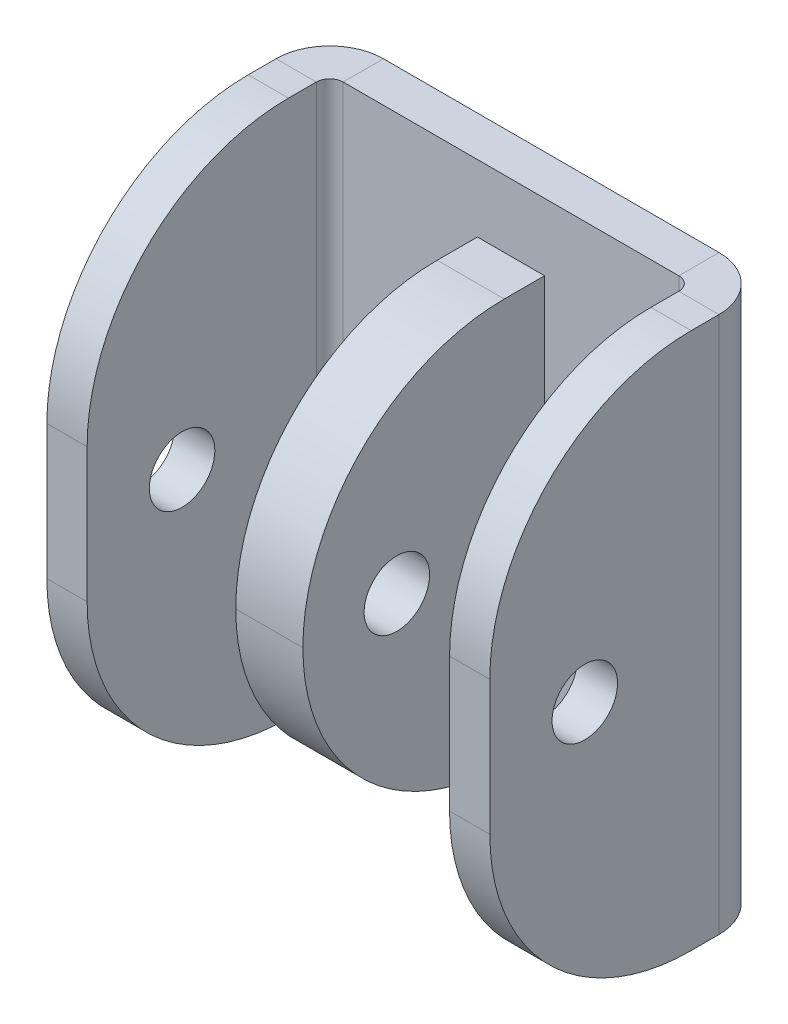
ISO-10303-21;
HEADER;
FILE_DESCRIPTION(('STEP AP214'),'2;1');
FILE_NAME('part.step','',(''),(''),'','','');
FILE_SCHEMA(('AUTOMOTIVE_DESIGN { 1 0 10303 214 1 1 1 1 }'));
ENDSEC;
DATA;
#1=APPLICATION_CONTEXT('core data for automotive mechanical design processes');
#2=APPLICATION_PROTOCOL_DEFINITION('international standard','automotive_design',2000,#1);
#3=PRODUCT_CONTEXT('',#1,'mechanical');
#4=PRODUCT('Part','Part','',(#3));
#5=PRODUCT_RELATED_PRODUCT_CATEGORY('part','',(#4));
#6=PRODUCT_DEFINITION_FORMATION('','',#4);
#7=PRODUCT_DEFINITION_CONTEXT('part definition',#1,'design');
#8=PRODUCT_DEFINITION('design','',#6,#7);
#9=PRODUCT_DEFINITION_SHAPE('','',#8);
#10=(LENGTH_UNIT() NAMED_UNIT(*) SI_UNIT(.MILLI.,.METRE.));
#11=(NAMED_UNIT(*) PLANE_ANGLE_UNIT() SI_UNIT($,.RADIAN.));
#12=(NAMED_UNIT(*) SI_UNIT($,.STERADIAN.) SOLID_ANGLE_UNIT());
#13=UNCERTAINTY_MEASURE_WITH_UNIT(LENGTH_MEASURE(1.E-05),#10,'distance_accuracy_value','');
#14=(GEOMETRIC_REPRESENTATION_CONTEXT(3) GLOBAL_UNCERTAINTY_ASSIGNED_CONTEXT((#13)) GLOBAL_UNIT_ASSIGNED_CONTEXT((#10,
#11,#12)) REPRESENTATION_CONTEXT('',''));
#15=CARTESIAN_POINT('',(0.,0.,0.));
#16=DIRECTION('',(0.,0.,1.));
#17=DIRECTION('',(1.,0.,0.));
#18=AXIS2_PLACEMENT_3D('',#15,#16,#17);
#19=CARTESIAN_POINT('',(0.,0.,3.));
#20=DIRECTION('',(0.,0.,1.));
#21=DIRECTION('',(1.,0.,0.));
#22=AXIS2_PLACEMENT_3D('',#19,#20,#21);
#23=PLANE('',#22);
#24=DIRECTION('',(1.,0.,0.));
#25=VECTOR('',#24,1.);
#26=CARTESIAN_POINT('',(-34.2624665260045,-15.6459633778807,3.));
#27=LINE('',#26,#25);
#28=CARTESIAN_POINT('',(-13.2624665260045,-15.6459633778807,3.));
#29=VERTEX_POINT('',#28);
#30=CARTESIAN_POINT('',(11.7375334739955,-15.6459633778807,3.));
#31=VERTEX_POINT('',#30);
#32=EDGE_CURVE('E333',#29,#31,#27,.T.);
#33=ORIENTED_EDGE('',*,*,#32,.T.);
#34=DIRECTION('',(0.,1.,0.));
#35=VECTOR('',#34,1.);
#36=CARTESIAN_POINT('',(11.7375334739955,0.,3.));
#37=LINE('',#36,#35);
#38=CARTESIAN_POINT('',(11.7375334739955,24.3540366221193,3.));
#39=VERTEX_POINT('',#38);
#40=EDGE_CURVE('E319',#31,#39,#37,.T.);
#41=ORIENTED_EDGE('',*,*,#40,.T.);
#42=DIRECTION('',(-1.,0.,0.));
#43=VECTOR('',#42,1.);
#44=CARTESIAN_POINT('',(-34.2624665260045,24.3540366221193,3.));
#45=LINE('',#44,#43);
#46=CARTESIAN_POINT('',(-13.2624665260045,24.3540366221193,3.));
#47=VERTEX_POINT('',#46);
#48=EDGE_CURVE('E310',#39,#47,#45,.T.);
#49=ORIENTED_EDGE('',*,*,#48,.T.);
#50=DIRECTION('',(0.,1.,0.));
#51=VECTOR('',#50,1.);
#52=CARTESIAN_POINT('',(-13.2624665260045,0.,3.));
#53=LINE('',#52,#51);
#54=EDGE_CURVE('E306',#29,#47,#53,.T.);
#55=ORIENTED_EDGE('',*,*,#54,.F.);
#56=EDGE_LOOP('',(#33,#41,#49,#55));
#57=FACE_BOUND('',#56,.T.);
#58=DIRECTION('',(1.,0.,0.));
#59=VECTOR('',#58,1.);
#60=CARTESIAN_POINT('',(-3.26246652600454,-10.6459633778807,3.));
#61=LINE('',#60,#59);
#62=CARTESIAN_POINT('',(-3.26246652600454,-10.6459633778807,3.));
#63=VERTEX_POINT('',#62);
#64=CARTESIAN_POINT('',(1.73753347399547,-10.6459633778807,3.));
#65=VERTEX_POINT('',#64);
#66=EDGE_CURVE('E197',#63,#65,#61,.T.);
#67=ORIENTED_EDGE('',*,*,#66,.F.);
#68=DIRECTION('',(0.,-1.,0.));
#69=VECTOR('',#68,1.);
#70=CARTESIAN_POINT('',(-3.26246652600454,19.3540366221193,3.));
#71=LINE('',#70,#69);
#72=CARTESIAN_POINT('',(-3.26246652600454,19.3540366221193,3.));
#73=VERTEX_POINT('',#72);
#74=EDGE_CURVE('E207',#73,#63,#71,.T.);
#75=ORIENTED_EDGE('',*,*,#74,.F.);
#76=DIRECTION('',(-1.,0.,0.));
#77=VECTOR('',#76,1.);
#78=CARTESIAN_POINT('',(-3.26246652600454,19.3540366221193,3.));
#79=LINE('',#78,#77);
#80=CARTESIAN_POINT('',(1.73753347399546,19.3540366221193,3.));
#81=VERTEX_POINT('',#80);
#82=EDGE_CURVE('E219',#81,#73,#79,.T.);
#83=ORIENTED_EDGE('',*,*,#82,.F.);
#84=DIRECTION('',(0.,1.,0.));
#85=VECTOR('',#84,1.);
#86=CARTESIAN_POINT('',(1.73753347399546,19.3540366221193,3.));
#87=LINE('',#86,#85);
#88=EDGE_CURVE('E217',#65,#81,#87,.T.);
#89=ORIENTED_EDGE('',*,*,#88,.F.);
#90=EDGE_LOOP('',(#67,#75,#83,#89));
#91=FACE_BOUND('',#90,.T.);
#92=ADVANCED_FACE('F49',(#57,#91),#23,.T.);
#93=CARTESIAN_POINT('',(-34.2624665260045,-15.6459633778807,3.));
#94=DIRECTION('',(0.,-1.,0.));
#95=DIRECTION('',(1.,0.,0.));
#96=AXIS2_PLACEMENT_3D('',#93,#94,#95);
#97=PLANE('',#96);
#98=DIRECTION('',(1.,0.,0.));
#99=VECTOR('',#98,1.);
#100=CARTESIAN_POINT('',(0.,-15.6459633778807,0.));
#101=LINE('',#100,#99);
#102=CARTESIAN_POINT('',(-13.2624665260045,-15.6459633778807,0.));
#103=VERTEX_POINT('',#102);
#104=CARTESIAN_POINT('',(11.7375334739955,-15.6459633778807,0.));
#105=VERTEX_POINT('',#104);
#106=EDGE_CURVE('E301',#103,#105,#101,.T.);
#107=ORIENTED_EDGE('',*,*,#106,.T.);
#108=DIRECTION('',(0.,0.,1.));
#109=VECTOR('',#108,1.);
#110=CARTESIAN_POINT('',(11.7375334739955,-15.6459633778807,3.));
#111=LINE('',#110,#109);
#112=EDGE_CURVE('E322',#105,#31,#111,.T.);
#113=ORIENTED_EDGE('',*,*,#112,.T.);
#114=ORIENTED_EDGE('',*,*,#32,.F.);
#115=DIRECTION('',(0.,0.,1.));
#116=VECTOR('',#115,1.);
#117=CARTESIAN_POINT('',(-13.2624665260045,-15.6459633778807,3.));
#118=LINE('',#117,#116);
#119=EDGE_CURVE('E316',#103,#29,#118,.T.);
#120=ORIENTED_EDGE('',*,*,#119,.F.);
#121=EDGE_LOOP('',(#107,#113,#114,#120));
#122=FACE_BOUND('',#121,.T.);
#123=ADVANCED_FACE('F430',(#122),#97,.T.);
#124=CARTESIAN_POINT('',(-34.2624665260045,24.3540366221193,3.));
#125=DIRECTION('',(0.,1.,0.));
#126=DIRECTION('',(-1.,0.,0.));
#127=AXIS2_PLACEMENT_3D('',#124,#125,#126);
#128=PLANE('',#127);
#129=ORIENTED_EDGE('',*,*,#48,.F.);
#130=DIRECTION('',(0.,0.,-1.));
#131=VECTOR('',#130,1.);
#132=CARTESIAN_POINT('',(11.7375334739955,24.3540366221193,3.));
#133=LINE('',#132,#131);
#134=CARTESIAN_POINT('',(11.7375334739955,24.3540366221193,0.));
#135=VERTEX_POINT('',#134);
#136=EDGE_CURVE('E327',#39,#135,#133,.T.);
#137=ORIENTED_EDGE('',*,*,#136,.T.);
#138=DIRECTION('',(1.,0.,0.));
#139=VECTOR('',#138,1.);
#140=CARTESIAN_POINT('',(0.,24.3540366221193,0.));
#141=LINE('',#140,#139);
#142=CARTESIAN_POINT('',(-13.2624665260045,24.3540366221193,0.));
#143=VERTEX_POINT('',#142);
#144=EDGE_CURVE('E331',#135,#143,#141,.F.);
#145=ORIENTED_EDGE('',*,*,#144,.T.);
#146=DIRECTION('',(0.,0.,-1.));
#147=VECTOR('',#146,1.);
#148=CARTESIAN_POINT('',(-13.2624665260045,24.3540366221193,3.));
#149=LINE('',#148,#147);
#150=EDGE_CURVE('E309',#47,#143,#149,.T.);
#151=ORIENTED_EDGE('',*,*,#150,.F.);
#152=EDGE_LOOP('',(#129,#137,#145,#151));
#153=FACE_BOUND('',#152,.T.);
#154=ADVANCED_FACE('F436',(#153),#128,.T.);
#155=CARTESIAN_POINT('',(0.,0.,0.));
#156=DIRECTION('',(0.,0.,1.));
#157=DIRECTION('',(1.,0.,0.));
#158=AXIS2_PLACEMENT_3D('',#155,#156,#157);
#159=PLANE('',#158);
#160=DIRECTION('',(0.,1.,0.));
#161=VECTOR('',#160,1.);
#162=CARTESIAN_POINT('',(11.7375334739955,0.,0.));
#163=LINE('',#162,#161);
#164=EDGE_CURVE('E325',#105,#135,#163,.T.);
#165=ORIENTED_EDGE('',*,*,#164,.F.);
#166=ORIENTED_EDGE('',*,*,#106,.F.);
#167=DIRECTION('',(0.,1.,0.));
#168=VECTOR('',#167,1.);
#169=CARTESIAN_POINT('',(-13.2624665260045,0.,0.));
#170=LINE('',#169,#168);
#171=EDGE_CURVE('E313',#103,#143,#170,.T.);
#172=ORIENTED_EDGE('',*,*,#171,.T.);
#173=ORIENTED_EDGE('',*,*,#144,.F.);
#174=EDGE_LOOP('',(#165,#166,#172,#173));
#175=FACE_BOUND('',#174,.T.);
#176=ADVANCED_FACE('F443',(#175),#159,.F.);
#177=CARTESIAN_POINT('',(-13.2624665260045,-15.6459633778807,4.));
#178=DIRECTION('',(0.,1.,0.));
#179=DIRECTION('',(0.,0.,1.));
#180=AXIS2_PLACEMENT_3D('',#177,#178,#179);
#181=PLANE('',#180);
#182=DIRECTION('',(1.,0.,0.));
#183=VECTOR('',#182,1.);
#184=CARTESIAN_POINT('',(-14.2624665260045,-15.6459633778807,4.));
#185=LINE('',#184,#183);
#186=CARTESIAN_POINT('',(-17.2624665260045,-15.6459633778807,4.00000000000001));
#187=VERTEX_POINT('',#186);
#188=CARTESIAN_POINT('',(-14.2624665260045,-15.6459633778807,4.));
#189=VERTEX_POINT('',#188);
#190=EDGE_CURVE('E268',#187,#189,#185,.T.);
#191=ORIENTED_EDGE('',*,*,#190,.F.);
#192=CARTESIAN_POINT('',(-13.2624665260045,-15.6459633778807,4.));
#193=DIRECTION('',(0.,-1.,0.));
#194=DIRECTION('',(0.,0.,-1.));
#195=AXIS2_PLACEMENT_3D('',#192,#193,#194);
#196=CIRCLE('',#195,4.);
#197=EDGE_CURVE('E271',#187,#103,#196,.T.);
#198=ORIENTED_EDGE('',*,*,#197,.T.);
#199=ORIENTED_EDGE('',*,*,#119,.T.);
#200=CARTESIAN_POINT('',(-13.2624665260045,-15.6459633778807,4.));
#201=DIRECTION('',(0.,-1.,0.));
#202=DIRECTION('',(0.,0.,-1.));
#203=AXIS2_PLACEMENT_3D('',#200,#201,#202);
#204=CIRCLE('',#203,1.);
#205=EDGE_CURVE('E294',#189,#29,#204,.T.);
#206=ORIENTED_EDGE('',*,*,#205,.F.);
#207=EDGE_LOOP('',(#191,#198,#199,#206));
#208=FACE_BOUND('',#207,.T.);
#209=ADVANCED_FACE('F446',(#208),#181,.F.);
#210=CARTESIAN_POINT('',(-13.2624665260045,24.3540366221193,4.));
#211=DIRECTION('',(0.,-1.,0.));
#212=DIRECTION('',(0.,0.,-1.));
#213=AXIS2_PLACEMENT_3D('',#210,#211,#212);
#214=PLANE('',#213);
#215=CARTESIAN_POINT('',(-13.2624665260045,24.3540366221193,4.));
#216=DIRECTION('',(0.,-1.,0.));
#217=DIRECTION('',(0.,0.,-1.));
#218=AXIS2_PLACEMENT_3D('',#215,#216,#217);
#219=CIRCLE('',#218,4.);
#220=CARTESIAN_POINT('',(-17.2624665260045,24.3540366221193,4.00000000000001));
#221=VERTEX_POINT('',#220);
#222=EDGE_CURVE('E298',#143,#221,#219,.F.);
#223=ORIENTED_EDGE('',*,*,#222,.T.);
#224=DIRECTION('',(-1.,0.,0.));
#225=VECTOR('',#224,1.);
#226=CARTESIAN_POINT('',(-14.2624665260045,24.3540366221193,4.));
#227=LINE('',#226,#225);
#228=CARTESIAN_POINT('',(-14.2624665260045,24.3540366221193,4.));
#229=VERTEX_POINT('',#228);
#230=EDGE_CURVE('E277',#229,#221,#227,.T.);
#231=ORIENTED_EDGE('',*,*,#230,.F.);
#232=CARTESIAN_POINT('',(-13.2624665260045,24.3540366221193,4.));
#233=DIRECTION('',(0.,1.,0.));
#234=DIRECTION('',(0.,0.,1.));
#235=AXIS2_PLACEMENT_3D('',#232,#233,#234);
#236=CIRCLE('',#235,1.);
#237=EDGE_CURVE('E297',#47,#229,#236,.T.);
#238=ORIENTED_EDGE('',*,*,#237,.F.);
#239=ORIENTED_EDGE('',*,*,#150,.T.);
#240=EDGE_LOOP('',(#223,#231,#238,#239));
#241=FACE_BOUND('',#240,.T.);
#242=ADVANCED_FACE('F440',(#241),#214,.F.);
#243=CARTESIAN_POINT('',(-13.2624665260045,44.6581462993805,4.));
#244=DIRECTION('',(0.,-1.,0.));
#245=DIRECTION('',(0.,0.,-1.));
#246=AXIS2_PLACEMENT_3D('',#243,#244,#245);
#247=CYLINDRICAL_SURFACE('',#246,1.);
#248=ORIENTED_EDGE('',*,*,#54,.T.);
#249=ORIENTED_EDGE('',*,*,#237,.T.);
#250=DIRECTION('',(0.,1.,0.));
#251=VECTOR('',#250,1.);
#252=CARTESIAN_POINT('',(-14.2624665260045,0.,4.));
#253=LINE('',#252,#251);
#254=EDGE_CURVE('E285',#189,#229,#253,.T.);
#255=ORIENTED_EDGE('',*,*,#254,.F.);
#256=ORIENTED_EDGE('',*,*,#205,.T.);
#257=EDGE_LOOP('',(#248,#249,#255,#256));
#258=FACE_BOUND('',#257,.T.);
#259=ADVANCED_FACE('F565',(#258),#247,.F.);
#260=CARTESIAN_POINT('',(-13.2624665260045,44.6581462993805,4.));
#261=DIRECTION('',(0.,-1.,0.));
#262=DIRECTION('',(0.,0.,-1.));
#263=AXIS2_PLACEMENT_3D('',#260,#261,#262);
#264=CYLINDRICAL_SURFACE('',#263,4.);
#265=ORIENTED_EDGE('',*,*,#171,.F.);
#266=ORIENTED_EDGE('',*,*,#197,.F.);
#267=DIRECTION('',(0.,1.,0.));
#268=VECTOR('',#267,1.);
#269=CARTESIAN_POINT('',(-17.2624665260045,0.,4.00000000000001));
#270=LINE('',#269,#268);
#271=EDGE_CURVE('E263',#187,#221,#270,.T.);
#272=ORIENTED_EDGE('',*,*,#271,.T.);
#273=ORIENTED_EDGE('',*,*,#222,.F.);
#274=EDGE_LOOP('',(#265,#266,#272,#273));
#275=FACE_BOUND('',#274,.T.);
#276=ADVANCED_FACE('F550',(#275),#264,.T.);
#277=CARTESIAN_POINT('',(-14.2624665260045,24.3540366221193,21.0730091830127));
#278=DIRECTION('',(0.,0.,1.));
#279=DIRECTION('',(0.,-1.,0.));
#280=AXIS2_PLACEMENT_3D('',#277,#278,#279);
#281=PLANE('',#280);
#282=DIRECTION('',(0.,1.,0.));
#283=VECTOR('',#282,1.);
#284=CARTESIAN_POINT('',(-17.2624665260045,0.,21.0730091830128));
#285=LINE('',#284,#283);
#286=CARTESIAN_POINT('',(-17.2624665260045,9.35403662211928,21.0730091830128));
#287=VERTEX_POINT('',#286);
#288=CARTESIAN_POINT('',(-17.2624665260045,-0.645963377880726,21.0730091830128));
#289=VERTEX_POINT('',#288);
#290=EDGE_CURVE('E289',#287,#289,#285,.F.);
#291=ORIENTED_EDGE('',*,*,#290,.T.);
#292=DIRECTION('',(1.,0.,0.));
#293=VECTOR('',#292,1.);
#294=CARTESIAN_POINT('',(-14.2624665260045,-0.645963377880726,21.0730091830127));
#295=LINE('',#294,#293);
#296=CARTESIAN_POINT('',(-14.2624665260045,-0.645963377880726,21.0730091830127));
#297=VERTEX_POINT('',#296);
#298=EDGE_CURVE('E377',#289,#297,#295,.T.);
#299=ORIENTED_EDGE('',*,*,#298,.T.);
#300=DIRECTION('',(0.,-1.,0.));
#301=VECTOR('',#300,1.);
#302=CARTESIAN_POINT('',(-14.2624665260045,24.3540366221193,21.0730091830127));
#303=LINE('',#302,#301);
#304=CARTESIAN_POINT('',(-14.2624665260045,9.35403662211928,21.0730091830127));
#305=VERTEX_POINT('',#304);
#306=EDGE_CURVE('E280',#305,#297,#303,.T.);
#307=ORIENTED_EDGE('',*,*,#306,.F.);
#308=DIRECTION('',(1.,0.,0.));
#309=VECTOR('',#308,1.);
#310=CARTESIAN_POINT('',(-14.2624665260045,9.35403662211928,21.0730091830127));
#311=LINE('',#310,#309);
#312=EDGE_CURVE('E343',#305,#287,#311,.F.);
#313=ORIENTED_EDGE('',*,*,#312,.T.);
#314=EDGE_LOOP('',(#291,#299,#307,#313));
#315=FACE_BOUND('',#314,.T.);
#316=ADVANCED_FACE('F546',(#315),#281,.T.);
#317=CARTESIAN_POINT('',(-14.2624665260046,0.,-13.1894573429918));
#318=DIRECTION('',(1.,0.,0.));
#319=DIRECTION('',(0.,0.,-1.));
#320=AXIS2_PLACEMENT_3D('',#317,#318,#319);
#321=PLANE('',#320);
#322=CARTESIAN_POINT('',(-14.2624665260045,4.35403662211927,13.9999999999999));
#323=DIRECTION('',(1.,0.,0.));
#324=DIRECTION('',(0.,0.,-1.));
#325=AXIS2_PLACEMENT_3D('',#322,#323,#324);
#326=CIRCLE('',#325,2.44);
#327=CARTESIAN_POINT('',(-14.2624665260045,4.35403662211927,11.5599999999999));
#328=VERTEX_POINT('',#327);
#329=EDGE_CURVE('E382',#328,#328,#326,.T.);
#330=ORIENTED_EDGE('',*,*,#329,.F.);
#331=EDGE_LOOP('',(#330));
#332=FACE_BOUND('',#331,.T.);
#333=ORIENTED_EDGE('',*,*,#306,.T.);
#334=CARTESIAN_POINT('',(-14.2624665260045,-0.645963377880726,6.07300918301275));
#335=DIRECTION('',(1.,0.,0.));
#336=DIRECTION('',(0.,0.,-1.));
#337=AXIS2_PLACEMENT_3D('',#334,#335,#336);
#338=CIRCLE('',#337,15.);
#339=CARTESIAN_POINT('',(-14.2624665260045,-15.6459633778807,6.07300918301275));
#340=VERTEX_POINT('',#339);
#341=EDGE_CURVE('E73',#297,#340,#338,.T.);
#342=ORIENTED_EDGE('',*,*,#341,.T.);
#343=DIRECTION('',(0.,0.,-1.));
#344=VECTOR('',#343,1.);
#345=CARTESIAN_POINT('',(-14.2624665260045,-15.6459633778807,21.0730091830127));
#346=LINE('',#345,#344);
#347=EDGE_CURVE('E287',#340,#189,#346,.T.);
#348=ORIENTED_EDGE('',*,*,#347,.T.);
#349=ORIENTED_EDGE('',*,*,#254,.T.);
#350=DIRECTION('',(0.,0.,1.));
#351=VECTOR('',#350,1.);
#352=CARTESIAN_POINT('',(-14.2624665260045,24.3540366221193,21.0730091830127));
#353=LINE('',#352,#351);
#354=CARTESIAN_POINT('',(-14.2624665260045,24.3540366221193,6.07300918301275));
#355=VERTEX_POINT('',#354);
#356=EDGE_CURVE('E282',#229,#355,#353,.T.);
#357=ORIENTED_EDGE('',*,*,#356,.T.);
#358=CARTESIAN_POINT('',(-14.2624665260045,9.35403662211928,6.07300918301275));
#359=DIRECTION('',(1.,0.,0.));
#360=DIRECTION('',(0.,0.,-1.));
#361=AXIS2_PLACEMENT_3D('',#358,#359,#360);
#362=CIRCLE('',#361,15.);
#363=EDGE_CURVE('E341',#355,#305,#362,.T.);
#364=ORIENTED_EDGE('',*,*,#363,.T.);
#365=EDGE_LOOP('',(#333,#342,#348,#349,#357,#364));
#366=FACE_BOUND('',#365,.T.);
#367=ADVANCED_FACE('F549',(#332,#366),#321,.T.);
#368=CARTESIAN_POINT('',(-14.2624665260045,24.3540366221193,21.0730091830127));
#369=DIRECTION('',(0.,1.,0.));
#370=DIRECTION('',(0.,0.,1.));
#371=AXIS2_PLACEMENT_3D('',#368,#369,#370);
#372=PLANE('',#371);
#373=DIRECTION('',(0.,0.,-1.));
#374=VECTOR('',#373,1.);
#375=CARTESIAN_POINT('',(-17.2624665260046,24.3540366221193,-13.1894573429918));
#376=LINE('',#375,#374);
#377=CARTESIAN_POINT('',(-17.2624665260045,24.3540366221193,6.07300918301276));
#378=VERTEX_POINT('',#377);
#379=EDGE_CURVE('E274',#221,#378,#376,.F.);
#380=ORIENTED_EDGE('',*,*,#379,.T.);
#381=DIRECTION('',(1.,0.,0.));
#382=VECTOR('',#381,1.);
#383=CARTESIAN_POINT('',(-14.2624665260045,24.3540366221193,6.07300918301275));
#384=LINE('',#383,#382);
#385=EDGE_CURVE('E330',#378,#355,#384,.T.);
#386=ORIENTED_EDGE('',*,*,#385,.T.);
#387=ORIENTED_EDGE('',*,*,#356,.F.);
#388=ORIENTED_EDGE('',*,*,#230,.T.);
#389=EDGE_LOOP('',(#380,#386,#387,#388));
#390=FACE_BOUND('',#389,.T.);
#391=ADVANCED_FACE('F554',(#390),#372,.T.);
#392=CARTESIAN_POINT('',(-17.2624665260046,0.,-13.1894573429918));
#393=DIRECTION('',(1.,0.,0.));
#394=DIRECTION('',(0.,0.,-1.));
#395=AXIS2_PLACEMENT_3D('',#392,#393,#394);
#396=PLANE('',#395);
#397=CARTESIAN_POINT('',(-17.2624665260045,4.35403662211927,13.9999999999999));
#398=DIRECTION('',(1.,0.,0.));
#399=DIRECTION('',(0.,0.,-1.));
#400=AXIS2_PLACEMENT_3D('',#397,#398,#399);
#401=CIRCLE('',#400,2.44);
#402=CARTESIAN_POINT('',(-17.2624665260045,4.35403662211927,11.5599999999999));
#403=VERTEX_POINT('',#402);
#404=EDGE_CURVE('E387',#403,#403,#401,.T.);
#405=ORIENTED_EDGE('',*,*,#404,.T.);
#406=EDGE_LOOP('',(#405));
#407=FACE_BOUND('',#406,.T.);
#408=DIRECTION('',(0.,0.,-1.));
#409=VECTOR('',#408,1.);
#410=CARTESIAN_POINT('',(-17.2624665260046,-15.6459633778807,-13.1894573429918));
#411=LINE('',#410,#409);
#412=CARTESIAN_POINT('',(-17.2624665260045,-15.6459633778807,6.07300918301276));
#413=VERTEX_POINT('',#412);
#414=EDGE_CURVE('E272',#413,#187,#411,.T.);
#415=ORIENTED_EDGE('',*,*,#414,.F.);
#416=CARTESIAN_POINT('',(-17.2624665260045,-0.645963377880726,6.07300918301276));
#417=DIRECTION('',(1.,0.,0.));
#418=DIRECTION('',(0.,0.,-1.));
#419=AXIS2_PLACEMENT_3D('',#416,#417,#418);
#420=CIRCLE('',#419,15.);
#421=EDGE_CURVE('E12',#413,#289,#420,.F.);
#422=ORIENTED_EDGE('',*,*,#421,.T.);
#423=ORIENTED_EDGE('',*,*,#290,.F.);
#424=CARTESIAN_POINT('',(-17.2624665260045,9.35403662211928,6.07300918301276));
#425=DIRECTION('',(1.,0.,0.));
#426=DIRECTION('',(0.,0.,-1.));
#427=AXIS2_PLACEMENT_3D('',#424,#425,#426);
#428=CIRCLE('',#427,15.);
#429=EDGE_CURVE('E345',#287,#378,#428,.F.);
#430=ORIENTED_EDGE('',*,*,#429,.T.);
#431=ORIENTED_EDGE('',*,*,#379,.F.);
#432=ORIENTED_EDGE('',*,*,#271,.F.);
#433=EDGE_LOOP('',(#415,#422,#423,#430,#431,#432));
#434=FACE_BOUND('',#433,.T.);
#435=ADVANCED_FACE('F558',(#407,#434),#396,.F.);
#436=CARTESIAN_POINT('',(-14.2624665260045,-15.6459633778807,21.0730091830127));
#437=DIRECTION('',(0.,-1.,0.));
#438=DIRECTION('',(0.,0.,-1.));
#439=AXIS2_PLACEMENT_3D('',#436,#437,#438);
#440=PLANE('',#439);
#441=ORIENTED_EDGE('',*,*,#347,.F.);
#442=DIRECTION('',(1.,0.,0.));
#443=VECTOR('',#442,1.);
#444=CARTESIAN_POINT('',(-14.2624665260045,-15.6459633778807,6.07300918301275));
#445=LINE('',#444,#443);
#446=EDGE_CURVE('E58',#340,#413,#445,.F.);
#447=ORIENTED_EDGE('',*,*,#446,.T.);
#448=ORIENTED_EDGE('',*,*,#414,.T.);
#449=ORIENTED_EDGE('',*,*,#190,.T.);
#450=EDGE_LOOP('',(#441,#447,#448,#449));
#451=FACE_BOUND('',#450,.T.);
#452=ADVANCED_FACE('F545',(#451),#440,.T.);
#453=CARTESIAN_POINT('',(11.7375334739955,-15.6459633778807,4.));
#454=DIRECTION('',(0.,1.,0.));
#455=DIRECTION('',(0.,0.,1.));
#456=AXIS2_PLACEMENT_3D('',#453,#454,#455);
#457=PLANE('',#456);
#458=ORIENTED_EDGE('',*,*,#112,.F.);
#459=CARTESIAN_POINT('',(11.7375334739955,-15.6459633778807,4.));
#460=DIRECTION('',(0.,1.,0.));
#461=DIRECTION('',(-1.,0.,0.));
#462=AXIS2_PLACEMENT_3D('',#459,#460,#461);
#463=CIRCLE('',#462,4.);
#464=CARTESIAN_POINT('',(15.7375334739955,-15.6459633778807,4.00000000000001));
#465=VERTEX_POINT('',#464);
#466=EDGE_CURVE('E230',#105,#465,#463,.F.);
#467=ORIENTED_EDGE('',*,*,#466,.T.);
#468=DIRECTION('',(-1.,0.,0.));
#469=VECTOR('',#468,1.);
#470=CARTESIAN_POINT('',(12.7375334739955,-15.6459633778807,4.));
#471=LINE('',#470,#469);
#472=CARTESIAN_POINT('',(12.7375334739955,-15.6459633778807,3.99999999999999));
#473=VERTEX_POINT('',#472);
#474=EDGE_CURVE('E248',#465,#473,#471,.T.);
#475=ORIENTED_EDGE('',*,*,#474,.T.);
#476=CARTESIAN_POINT('',(11.7375334739955,-15.6459633778807,4.));
#477=DIRECTION('',(0.,-1.,0.));
#478=DIRECTION('',(0.,0.,-1.));
#479=AXIS2_PLACEMENT_3D('',#476,#477,#478);
#480=CIRCLE('',#479,1.);
#481=EDGE_CURVE('E256',#31,#473,#480,.T.);
#482=ORIENTED_EDGE('',*,*,#481,.F.);
#483=EDGE_LOOP('',(#458,#467,#475,#482));
#484=FACE_BOUND('',#483,.T.);
#485=ADVANCED_FACE('F501',(#484),#457,.F.);
#486=CARTESIAN_POINT('',(11.7375334739955,24.3540366221193,4.));
#487=DIRECTION('',(0.,-1.,0.));
#488=DIRECTION('',(0.,0.,-1.));
#489=AXIS2_PLACEMENT_3D('',#486,#487,#488);
#490=PLANE('',#489);
#491=DIRECTION('',(1.,0.,0.));
#492=VECTOR('',#491,1.);
#493=CARTESIAN_POINT('',(12.7375334739955,24.3540366221193,4.));
#494=LINE('',#493,#492);
#495=CARTESIAN_POINT('',(12.7375334739955,24.3540366221193,4.));
#496=VERTEX_POINT('',#495);
#497=CARTESIAN_POINT('',(15.7375334739955,24.3540366221193,4.00000000000001));
#498=VERTEX_POINT('',#497);
#499=EDGE_CURVE('E251',#496,#498,#494,.T.);
#500=ORIENTED_EDGE('',*,*,#499,.T.);
#501=CARTESIAN_POINT('',(11.7375334739955,24.3540366221193,4.));
#502=DIRECTION('',(0.,1.,0.));
#503=DIRECTION('',(-1.,0.,0.));
#504=AXIS2_PLACEMENT_3D('',#501,#502,#503);
#505=CIRCLE('',#504,4.);
#506=EDGE_CURVE('E260',#498,#135,#505,.T.);
#507=ORIENTED_EDGE('',*,*,#506,.T.);
#508=ORIENTED_EDGE('',*,*,#136,.F.);
#509=CARTESIAN_POINT('',(11.7375334739955,24.3540366221193,4.));
#510=DIRECTION('',(0.,1.,0.));
#511=DIRECTION('',(0.,0.,1.));
#512=AXIS2_PLACEMENT_3D('',#509,#510,#511);
#513=CIRCLE('',#512,1.);
#514=EDGE_CURVE('E259',#496,#39,#513,.T.);
#515=ORIENTED_EDGE('',*,*,#514,.F.);
#516=EDGE_LOOP('',(#500,#507,#508,#515));
#517=FACE_BOUND('',#516,.T.);
#518=ADVANCED_FACE('F520',(#517),#490,.F.);
#519=CARTESIAN_POINT('',(11.7375334739955,-35.950073055142,4.));
#520=DIRECTION('',(0.,1.,0.));
#521=DIRECTION('',(-1.,0.,0.));
#522=AXIS2_PLACEMENT_3D('',#519,#520,#521);
#523=CYLINDRICAL_SURFACE('',#522,1.);
#524=ORIENTED_EDGE('',*,*,#514,.T.);
#525=ORIENTED_EDGE('',*,*,#40,.F.);
#526=ORIENTED_EDGE('',*,*,#481,.T.);
#527=DIRECTION('',(0.,1.,0.));
#528=VECTOR('',#527,1.);
#529=CARTESIAN_POINT('',(12.7375334739955,0.,4.));
#530=LINE('',#529,#528);
#531=EDGE_CURVE('E203',#473,#496,#530,.T.);
#532=ORIENTED_EDGE('',*,*,#531,.T.);
#533=EDGE_LOOP('',(#524,#525,#526,#532));
#534=FACE_BOUND('',#533,.T.);
#535=ADVANCED_FACE('F505',(#534),#523,.F.);
#536=CARTESIAN_POINT('',(11.7375334739955,-35.950073055142,4.));
#537=DIRECTION('',(0.,1.,0.));
#538=DIRECTION('',(-1.,0.,0.));
#539=AXIS2_PLACEMENT_3D('',#536,#537,#538);
#540=CYLINDRICAL_SURFACE('',#539,4.);
#541=ORIENTED_EDGE('',*,*,#506,.F.);
#542=DIRECTION('',(0.,1.,0.));
#543=VECTOR('',#542,1.);
#544=CARTESIAN_POINT('',(15.7375334739955,0.,4.00000000000001));
#545=LINE('',#544,#543);
#546=EDGE_CURVE('E231',#465,#498,#545,.T.);
#547=ORIENTED_EDGE('',*,*,#546,.F.);
#548=ORIENTED_EDGE('',*,*,#466,.F.);
#549=ORIENTED_EDGE('',*,*,#164,.T.);
#550=EDGE_LOOP('',(#541,#547,#548,#549));
#551=FACE_BOUND('',#550,.T.);
#552=ADVANCED_FACE('F513',(#551),#540,.T.);
#553=CARTESIAN_POINT('',(12.7375334739954,24.3540366221193,21.0730091830127));
#554=DIRECTION('',(0.,0.,1.));
#555=DIRECTION('',(0.,1.,0.));
#556=AXIS2_PLACEMENT_3D('',#553,#554,#555);
#557=PLANE('',#556);
#558=DIRECTION('',(0.,1.,0.));
#559=VECTOR('',#558,1.);
#560=CARTESIAN_POINT('',(12.7375334739954,24.3540366221193,21.0730091830127));
#561=LINE('',#560,#559);
#562=CARTESIAN_POINT('',(12.7375334739954,-0.64596337788073,21.0730091830127));
#563=VERTEX_POINT('',#562);
#564=CARTESIAN_POINT('',(12.7375334739954,9.35403662211927,21.0730091830127));
#565=VERTEX_POINT('',#564);
#566=EDGE_CURVE('E239',#563,#565,#561,.T.);
#567=ORIENTED_EDGE('',*,*,#566,.F.);
#568=DIRECTION('',(-1.,0.,0.));
#569=VECTOR('',#568,1.);
#570=CARTESIAN_POINT('',(12.7375334739954,-0.64596337788073,21.0730091830127));
#571=LINE('',#570,#569);
#572=CARTESIAN_POINT('',(15.7375334739954,-0.645963377880729,21.0730091830128));
#573=VERTEX_POINT('',#572);
#574=EDGE_CURVE('E357',#563,#573,#571,.F.);
#575=ORIENTED_EDGE('',*,*,#574,.T.);
#576=DIRECTION('',(0.,1.,0.));
#577=VECTOR('',#576,1.);
#578=CARTESIAN_POINT('',(15.7375334739954,0.,21.0730091830128));
#579=LINE('',#578,#577);
#580=CARTESIAN_POINT('',(15.7375334739954,9.35403662211927,21.0730091830128));
#581=VERTEX_POINT('',#580);
#582=EDGE_CURVE('E245',#573,#581,#579,.T.);
#583=ORIENTED_EDGE('',*,*,#582,.T.);
#584=DIRECTION('',(-1.,0.,0.));
#585=VECTOR('',#584,1.);
#586=CARTESIAN_POINT('',(12.7375334739954,9.35403662211927,21.0730091830127));
#587=LINE('',#586,#585);
#588=EDGE_CURVE('E354',#581,#565,#587,.T.);
#589=ORIENTED_EDGE('',*,*,#588,.T.);
#590=EDGE_LOOP('',(#567,#575,#583,#589));
#591=FACE_BOUND('',#590,.T.);
#592=ADVANCED_FACE('F492',(#591),#557,.T.);
#593=CARTESIAN_POINT('',(12.7375334739955,0.,-11.6645242909827));
#594=DIRECTION('',(-1.,0.,0.));
#595=DIRECTION('',(0.,0.,1.));
#596=AXIS2_PLACEMENT_3D('',#593,#594,#595);
#597=PLANE('',#596);
#598=CARTESIAN_POINT('',(12.7375334739954,4.35403662211928,14.));
#599=DIRECTION('',(-1.,0.,0.));
#600=DIRECTION('',(0.,0.,1.));
#601=AXIS2_PLACEMENT_3D('',#598,#599,#600);
#602=CIRCLE('',#601,2.44);
#603=CARTESIAN_POINT('',(12.7375334739954,4.35403662211928,16.44));
#604=VERTEX_POINT('',#603);
#605=EDGE_CURVE('E391',#604,#604,#602,.T.);
#606=ORIENTED_EDGE('',*,*,#605,.F.);
#607=EDGE_LOOP('',(#606));
#608=FACE_BOUND('',#607,.T.);
#609=DIRECTION('',(0.,0.,1.));
#610=VECTOR('',#609,1.);
#611=CARTESIAN_POINT('',(12.7375334739956,-15.6459633778807,-45.9269908169873));
#612=LINE('',#611,#610);
#613=CARTESIAN_POINT('',(12.7375334739955,-15.6459633778807,6.07300918301273));
#614=VERTEX_POINT('',#613);
#615=EDGE_CURVE('E242',#473,#614,#612,.T.);
#616=ORIENTED_EDGE('',*,*,#615,.T.);
#617=CARTESIAN_POINT('',(12.7375334739955,-0.645963377880726,6.07300918301273));
#618=DIRECTION('',(-1.,0.,0.));
#619=DIRECTION('',(0.,0.,1.));
#620=AXIS2_PLACEMENT_3D('',#617,#618,#619);
#621=CIRCLE('',#620,15.);
#622=EDGE_CURVE('E352',#614,#563,#621,.T.);
#623=ORIENTED_EDGE('',*,*,#622,.T.);
#624=ORIENTED_EDGE('',*,*,#566,.T.);
#625=CARTESIAN_POINT('',(12.7375334739955,9.35403662211928,6.07300918301274));
#626=DIRECTION('',(-1.,0.,0.));
#627=DIRECTION('',(0.,0.,1.));
#628=AXIS2_PLACEMENT_3D('',#625,#626,#627);
#629=CIRCLE('',#628,15.);
#630=CARTESIAN_POINT('',(12.7375334739955,24.3540366221193,6.07300918301275));
#631=VERTEX_POINT('',#630);
#632=EDGE_CURVE('E350',#565,#631,#629,.T.);
#633=ORIENTED_EDGE('',*,*,#632,.T.);
#634=DIRECTION('',(0.,0.,-1.));
#635=VECTOR('',#634,1.);
#636=CARTESIAN_POINT('',(12.7375334739956,24.3540366221193,-45.9269908169873));
#637=LINE('',#636,#635);
#638=EDGE_CURVE('E237',#631,#496,#637,.T.);
#639=ORIENTED_EDGE('',*,*,#638,.T.);
#640=ORIENTED_EDGE('',*,*,#531,.F.);
#641=EDGE_LOOP('',(#616,#623,#624,#633,#639,#640));
#642=FACE_BOUND('',#641,.T.);
#643=ADVANCED_FACE('F488',(#608,#642),#597,.T.);
#644=CARTESIAN_POINT('',(12.7375334739956,-15.6459633778807,-45.9269908169873));
#645=DIRECTION('',(0.,-1.,0.));
#646=DIRECTION('',(0.,0.,1.));
#647=AXIS2_PLACEMENT_3D('',#644,#645,#646);
#648=PLANE('',#647);
#649=DIRECTION('',(0.,0.,1.));
#650=VECTOR('',#649,1.);
#651=CARTESIAN_POINT('',(15.7375334739955,-15.6459633778807,-11.6645242909827));
#652=LINE('',#651,#650);
#653=CARTESIAN_POINT('',(15.7375334739955,-15.6459633778807,6.07300918301274));
#654=VERTEX_POINT('',#653);
#655=EDGE_CURVE('E234',#465,#654,#652,.T.);
#656=ORIENTED_EDGE('',*,*,#655,.T.);
#657=DIRECTION('',(-1.,0.,0.));
#658=VECTOR('',#657,1.);
#659=CARTESIAN_POINT('',(12.7375334739955,-15.6459633778807,6.07300918301273));
#660=LINE('',#659,#658);
#661=EDGE_CURVE('E347',#654,#614,#660,.T.);
#662=ORIENTED_EDGE('',*,*,#661,.T.);
#663=ORIENTED_EDGE('',*,*,#615,.F.);
#664=ORIENTED_EDGE('',*,*,#474,.F.);
#665=EDGE_LOOP('',(#656,#662,#663,#664));
#666=FACE_BOUND('',#665,.T.);
#667=ADVANCED_FACE('F491',(#666),#648,.T.);
#668=CARTESIAN_POINT('',(15.7375334739955,0.,-11.6645242909827));
#669=DIRECTION('',(-1.,0.,0.));
#670=DIRECTION('',(0.,0.,1.));
#671=AXIS2_PLACEMENT_3D('',#668,#669,#670);
#672=PLANE('',#671);
#673=CARTESIAN_POINT('',(15.7375334739954,4.35403662211928,14.));
#674=DIRECTION('',(1.,0.,0.));
#675=DIRECTION('',(0.,0.,-1.));
#676=AXIS2_PLACEMENT_3D('',#673,#674,#675);
#677=CIRCLE('',#676,2.44);
#678=CARTESIAN_POINT('',(15.7375334739954,4.35403662211928,11.56));
#679=VERTEX_POINT('',#678);
#680=EDGE_CURVE('E399',#679,#679,#677,.T.);
#681=ORIENTED_EDGE('',*,*,#680,.F.);
#682=EDGE_LOOP('',(#681));
#683=FACE_BOUND('',#682,.T.);
#684=ORIENTED_EDGE('',*,*,#582,.F.);
#685=CARTESIAN_POINT('',(15.7375334739955,-0.645963377880725,6.07300918301274));
#686=DIRECTION('',(-1.,0.,0.));
#687=DIRECTION('',(0.,0.,1.));
#688=AXIS2_PLACEMENT_3D('',#685,#686,#687);
#689=CIRCLE('',#688,15.);
#690=EDGE_CURVE('E361',#573,#654,#689,.F.);
#691=ORIENTED_EDGE('',*,*,#690,.T.);
#692=ORIENTED_EDGE('',*,*,#655,.F.);
#693=ORIENTED_EDGE('',*,*,#546,.T.);
#694=DIRECTION('',(0.,0.,1.));
#695=VECTOR('',#694,1.);
#696=CARTESIAN_POINT('',(15.7375334739955,24.3540366221193,-11.6645242909827));
#697=LINE('',#696,#695);
#698=CARTESIAN_POINT('',(15.7375334739955,24.3540366221193,6.07300918301276));
#699=VERTEX_POINT('',#698);
#700=EDGE_CURVE('E228',#699,#498,#697,.F.);
#701=ORIENTED_EDGE('',*,*,#700,.F.);
#702=CARTESIAN_POINT('',(15.7375334739955,9.35403662211928,6.07300918301275));
#703=DIRECTION('',(-1.,0.,0.));
#704=DIRECTION('',(0.,0.,1.));
#705=AXIS2_PLACEMENT_3D('',#702,#703,#704);
#706=CIRCLE('',#705,15.);
#707=EDGE_CURVE('E359',#699,#581,#706,.F.);
#708=ORIENTED_EDGE('',*,*,#707,.T.);
#709=EDGE_LOOP('',(#684,#691,#692,#693,#701,#708));
#710=FACE_BOUND('',#709,.T.);
#711=ADVANCED_FACE('F425',(#683,#710),#672,.F.);
#712=CARTESIAN_POINT('',(12.7375334739956,24.3540366221193,-45.9269908169873));
#713=DIRECTION('',(0.,1.,0.));
#714=DIRECTION('',(0.,0.,-1.));
#715=AXIS2_PLACEMENT_3D('',#712,#713,#714);
#716=PLANE('',#715);
#717=ORIENTED_EDGE('',*,*,#638,.F.);
#718=DIRECTION('',(-1.,0.,0.));
#719=VECTOR('',#718,1.);
#720=CARTESIAN_POINT('',(12.7375334739955,24.3540366221193,6.07300918301274));
#721=LINE('',#720,#719);
#722=EDGE_CURVE('E363',#631,#699,#721,.F.);
#723=ORIENTED_EDGE('',*,*,#722,.T.);
#724=ORIENTED_EDGE('',*,*,#700,.T.);
#725=ORIENTED_EDGE('',*,*,#499,.F.);
#726=EDGE_LOOP('',(#717,#723,#724,#725));
#727=FACE_BOUND('',#726,.T.);
#728=ADVANCED_FACE('F418',(#727),#716,.T.);
#729=CARTESIAN_POINT('',(-3.26246652600454,19.3540366221193,21.));
#730=DIRECTION('',(1.,0.,0.));
#731=DIRECTION('',(0.,1.,0.));
#732=AXIS2_PLACEMENT_3D('',#729,#730,#731);
#733=PLANE('',#732);
#734=CARTESIAN_POINT('',(-3.26246652600454,4.35403662211927,13.9999999999999));
#735=DIRECTION('',(1.,0.,0.));
#736=DIRECTION('',(0.,1.,0.));
#737=AXIS2_PLACEMENT_3D('',#734,#735,#736);
#738=CIRCLE('',#737,2.44);
#739=CARTESIAN_POINT('',(-3.26246652600454,6.79403662211927,13.9999999999999));
#740=VERTEX_POINT('',#739);
#741=EDGE_CURVE('E396',#740,#740,#738,.T.);
#742=ORIENTED_EDGE('',*,*,#741,.T.);
#743=EDGE_LOOP('',(#742));
#744=FACE_BOUND('',#743,.T.);
#745=CARTESIAN_POINT('',(-3.26246652600454,4.35403662211928,6.00000000000001));
#746=DIRECTION('',(1.,0.,0.));
#747=DIRECTION('',(0.,1.,0.));
#748=AXIS2_PLACEMENT_3D('',#745,#746,#747);
#749=CIRCLE('',#748,15.);
#750=CARTESIAN_POINT('',(-3.26246652600454,-10.6459633778807,6.00000000000001));
#751=VERTEX_POINT('',#750);
#752=CARTESIAN_POINT('',(-3.26246652600454,4.35403662211928,21.));
#753=VERTEX_POINT('',#752);
#754=EDGE_CURVE('E365',#751,#753,#749,.F.);
#755=ORIENTED_EDGE('',*,*,#754,.T.);
#756=CARTESIAN_POINT('',(-3.26246652600454,4.35403662211928,6.00000000000001));
#757=DIRECTION('',(1.,0.,0.));
#758=DIRECTION('',(0.,1.,0.));
#759=AXIS2_PLACEMENT_3D('',#756,#757,#758);
#760=CIRCLE('',#759,15.);
#761=CARTESIAN_POINT('',(-3.26246652600454,19.3540366221193,6.00000000000001));
#762=VERTEX_POINT('',#761);
#763=EDGE_CURVE('E367',#753,#762,#760,.F.);
#764=ORIENTED_EDGE('',*,*,#763,.T.);
#765=DIRECTION('',(0.,0.,-1.));
#766=VECTOR('',#765,1.);
#767=CARTESIAN_POINT('',(-3.26246652600454,19.3540366221193,21.));
#768=LINE('',#767,#766);
#769=EDGE_CURVE('E210',#762,#73,#768,.T.);
#770=ORIENTED_EDGE('',*,*,#769,.T.);
#771=ORIENTED_EDGE('',*,*,#74,.T.);
#772=DIRECTION('',(0.,0.,-1.));
#773=VECTOR('',#772,1.);
#774=CARTESIAN_POINT('',(-3.26246652600454,-10.6459633778807,21.));
#775=LINE('',#774,#773);
#776=EDGE_CURVE('E192',#751,#63,#775,.T.);
#777=ORIENTED_EDGE('',*,*,#776,.F.);
#778=EDGE_LOOP('',(#755,#764,#770,#771,#777));
#779=FACE_BOUND('',#778,.T.);
#780=ADVANCED_FACE('F208',(#744,#779),#733,.F.);
#781=CARTESIAN_POINT('',(-3.26246652600454,-10.6459633778807,21.));
#782=DIRECTION('',(0.,1.,0.));
#783=DIRECTION('',(0.,0.,1.));
#784=AXIS2_PLACEMENT_3D('',#781,#782,#783);
#785=PLANE('',#784);
#786=DIRECTION('',(0.,0.,-1.));
#787=VECTOR('',#786,1.);
#788=CARTESIAN_POINT('',(1.73753347399547,-10.6459633778807,21.));
#789=LINE('',#788,#787);
#790=CARTESIAN_POINT('',(1.73753347399547,-10.6459633778807,6.00000000000001));
#791=VERTEX_POINT('',#790);
#792=EDGE_CURVE('E204',#791,#65,#789,.T.);
#793=ORIENTED_EDGE('',*,*,#792,.F.);
#794=DIRECTION('',(1.,0.,0.));
#795=VECTOR('',#794,1.);
#796=CARTESIAN_POINT('',(-3.26246652600454,-10.6459633778807,6.00000000000001));
#797=LINE('',#796,#795);
#798=EDGE_CURVE('E200',#791,#751,#797,.F.);
#799=ORIENTED_EDGE('',*,*,#798,.T.);
#800=ORIENTED_EDGE('',*,*,#776,.T.);
#801=ORIENTED_EDGE('',*,*,#66,.T.);
#802=EDGE_LOOP('',(#793,#799,#800,#801));
#803=FACE_BOUND('',#802,.T.);
#804=ADVANCED_FACE('F195',(#803),#785,.F.);
#805=CARTESIAN_POINT('',(1.73753347399546,19.3540366221193,21.));
#806=DIRECTION('',(-1.,0.,0.));
#807=DIRECTION('',(0.,-1.,0.));
#808=AXIS2_PLACEMENT_3D('',#805,#806,#807);
#809=PLANE('',#808);
#810=CARTESIAN_POINT('',(1.73753347399546,4.35403662211927,14.));
#811=DIRECTION('',(-1.,0.,0.));
#812=DIRECTION('',(0.,-1.,0.));
#813=AXIS2_PLACEMENT_3D('',#810,#811,#812);
#814=CIRCLE('',#813,2.44);
#815=CARTESIAN_POINT('',(1.73753347399546,1.91403662211927,14.));
#816=VERTEX_POINT('',#815);
#817=EDGE_CURVE('E53',#816,#816,#814,.T.);
#818=ORIENTED_EDGE('',*,*,#817,.T.);
#819=EDGE_LOOP('',(#818));
#820=FACE_BOUND('',#819,.T.);
#821=DIRECTION('',(0.,0.,-1.));
#822=VECTOR('',#821,1.);
#823=CARTESIAN_POINT('',(1.73753347399546,19.3540366221193,21.));
#824=LINE('',#823,#822);
#825=CARTESIAN_POINT('',(1.73753347399546,19.3540366221193,6.00000000000001));
#826=VERTEX_POINT('',#825);
#827=EDGE_CURVE('E225',#826,#81,#824,.T.);
#828=ORIENTED_EDGE('',*,*,#827,.F.);
#829=CARTESIAN_POINT('',(1.73753347399546,4.35403662211928,6.00000000000001));
#830=DIRECTION('',(-1.,0.,0.));
#831=DIRECTION('',(0.,-1.,0.));
#832=AXIS2_PLACEMENT_3D('',#829,#830,#831);
#833=CIRCLE('',#832,15.);
#834=CARTESIAN_POINT('',(1.73753347399546,4.35403662211928,21.));
#835=VERTEX_POINT('',#834);
#836=EDGE_CURVE('E374',#826,#835,#833,.F.);
#837=ORIENTED_EDGE('',*,*,#836,.T.);
#838=CARTESIAN_POINT('',(1.73753347399546,4.35403662211928,6.00000000000001));
#839=DIRECTION('',(-1.,0.,0.));
#840=DIRECTION('',(0.,-1.,0.));
#841=AXIS2_PLACEMENT_3D('',#838,#839,#840);
#842=CIRCLE('',#841,15.);
#843=EDGE_CURVE('E372',#835,#791,#842,.F.);
#844=ORIENTED_EDGE('',*,*,#843,.T.);
#845=ORIENTED_EDGE('',*,*,#792,.T.);
#846=ORIENTED_EDGE('',*,*,#88,.T.);
#847=EDGE_LOOP('',(#828,#837,#844,#845,#846));
#848=FACE_BOUND('',#847,.T.);
#849=ADVANCED_FACE('F406',(#820,#848),#809,.F.);
#850=CARTESIAN_POINT('',(-3.26246652600454,19.3540366221193,21.));
#851=DIRECTION('',(0.,-1.,0.));
#852=DIRECTION('',(0.,0.,-1.));
#853=AXIS2_PLACEMENT_3D('',#850,#851,#852);
#854=PLANE('',#853);
#855=ORIENTED_EDGE('',*,*,#769,.F.);
#856=DIRECTION('',(-1.,0.,0.));
#857=VECTOR('',#856,1.);
#858=CARTESIAN_POINT('',(1.73753347399546,19.3540366221193,6.00000000000001));
#859=LINE('',#858,#857);
#860=EDGE_CURVE('E369',#762,#826,#859,.F.);
#861=ORIENTED_EDGE('',*,*,#860,.T.);
#862=ORIENTED_EDGE('',*,*,#827,.T.);
#863=ORIENTED_EDGE('',*,*,#82,.T.);
#864=EDGE_LOOP('',(#855,#861,#862,#863));
#865=FACE_BOUND('',#864,.T.);
#866=ADVANCED_FACE('F455',(#865),#854,.F.);
#867=CARTESIAN_POINT('',(-14.2624665260045,9.35403662211928,6.07300918301275));
#868=DIRECTION('',(1.,0.,0.));
#869=DIRECTION('',(0.,0.,-1.));
#870=AXIS2_PLACEMENT_3D('',#867,#868,#869);
#871=CYLINDRICAL_SURFACE('',#870,15.);
#872=ORIENTED_EDGE('',*,*,#429,.F.);
#873=ORIENTED_EDGE('',*,*,#312,.F.);
#874=ORIENTED_EDGE('',*,*,#363,.F.);
#875=ORIENTED_EDGE('',*,*,#385,.F.);
#876=EDGE_LOOP('',(#872,#873,#874,#875));
#877=FACE_BOUND('',#876,.T.);
#878=ADVANCED_FACE('F451',(#877),#871,.T.);
#879=CARTESIAN_POINT('',(12.7375334739955,-0.645963377880726,6.07300918301273));
#880=DIRECTION('',(-1.,0.,0.));
#881=DIRECTION('',(0.,0.,1.));
#882=AXIS2_PLACEMENT_3D('',#879,#880,#881);
#883=CYLINDRICAL_SURFACE('',#882,15.);
#884=ORIENTED_EDGE('',*,*,#690,.F.);
#885=ORIENTED_EDGE('',*,*,#574,.F.);
#886=ORIENTED_EDGE('',*,*,#622,.F.);
#887=ORIENTED_EDGE('',*,*,#661,.F.);
#888=EDGE_LOOP('',(#884,#885,#886,#887));
#889=FACE_BOUND('',#888,.T.);
#890=ADVANCED_FACE('F454',(#889),#883,.T.);
#891=CARTESIAN_POINT('',(12.7375334739955,9.35403662211928,6.07300918301274));
#892=DIRECTION('',(-1.,0.,0.));
#893=DIRECTION('',(0.,0.,1.));
#894=AXIS2_PLACEMENT_3D('',#891,#892,#893);
#895=CYLINDRICAL_SURFACE('',#894,15.);
#896=ORIENTED_EDGE('',*,*,#707,.F.);
#897=ORIENTED_EDGE('',*,*,#722,.F.);
#898=ORIENTED_EDGE('',*,*,#632,.F.);
#899=ORIENTED_EDGE('',*,*,#588,.F.);
#900=EDGE_LOOP('',(#896,#897,#898,#899));
#901=FACE_BOUND('',#900,.T.);
#902=ADVANCED_FACE('F459',(#901),#895,.T.);
#903=CARTESIAN_POINT('',(0.,4.35403662211928,6.00000000000001));
#904=DIRECTION('',(-1.,0.,0.));
#905=DIRECTION('',(0.,0.,1.));
#906=AXIS2_PLACEMENT_3D('',#903,#904,#905);
#907=CYLINDRICAL_SURFACE('',#906,15.);
#908=ORIENTED_EDGE('',*,*,#798,.F.);
#909=ORIENTED_EDGE('',*,*,#843,.F.);
#910=DIRECTION('',(1.,0.,0.));
#911=VECTOR('',#910,1.);
#912=CARTESIAN_POINT('',(1.73753347399547,4.35403662211928,21.));
#913=LINE('',#912,#911);
#914=EDGE_CURVE('E214',#753,#835,#913,.T.);
#915=ORIENTED_EDGE('',*,*,#914,.F.);
#916=ORIENTED_EDGE('',*,*,#754,.F.);
#917=EDGE_LOOP('',(#908,#909,#915,#916));
#918=FACE_BOUND('',#917,.T.);
#919=ADVANCED_FACE('F463',(#918),#907,.T.);
#920=CARTESIAN_POINT('',(0.,4.35403662211928,6.00000000000001));
#921=DIRECTION('',(1.,0.,0.));
#922=DIRECTION('',(0.,0.,-1.));
#923=AXIS2_PLACEMENT_3D('',#920,#921,#922);
#924=CYLINDRICAL_SURFACE('',#923,15.);
#925=ORIENTED_EDGE('',*,*,#836,.F.);
#926=ORIENTED_EDGE('',*,*,#860,.F.);
#927=ORIENTED_EDGE('',*,*,#763,.F.);
#928=ORIENTED_EDGE('',*,*,#914,.T.);
#929=EDGE_LOOP('',(#925,#926,#927,#928));
#930=FACE_BOUND('',#929,.T.);
#931=ADVANCED_FACE('F465',(#930),#924,.T.);
#932=CARTESIAN_POINT('',(-14.2624665260045,-0.645963377880726,6.07300918301275));
#933=DIRECTION('',(1.,0.,0.));
#934=DIRECTION('',(0.,0.,-1.));
#935=AXIS2_PLACEMENT_3D('',#932,#933,#934);
#936=CYLINDRICAL_SURFACE('',#935,15.);
#937=ORIENTED_EDGE('',*,*,#421,.F.);
#938=ORIENTED_EDGE('',*,*,#446,.F.);
#939=ORIENTED_EDGE('',*,*,#341,.F.);
#940=ORIENTED_EDGE('',*,*,#298,.F.);
#941=EDGE_LOOP('',(#937,#938,#939,#940));
#942=FACE_BOUND('',#941,.T.);
#943=ADVANCED_FACE('F51',(#942),#936,.T.);
#944=CARTESIAN_POINT('',(-27.2624665260046,4.35403662211926,13.9999999999999));
#945=DIRECTION('',(1.,0.,0.));
#946=DIRECTION('',(0.,0.,-1.));
#947=AXIS2_PLACEMENT_3D('',#944,#945,#946);
#948=CYLINDRICAL_SURFACE('',#947,2.44);
#949=ORIENTED_EDGE('',*,*,#817,.F.);
#950=EDGE_LOOP('',(#949));
#951=FACE_BOUND('',#950,.T.);
#952=ORIENTED_EDGE('',*,*,#741,.F.);
#953=EDGE_LOOP('',(#952));
#954=FACE_BOUND('',#953,.T.);
#955=ADVANCED_FACE('F409',(#951,#954),#948,.F.);
#956=ORIENTED_EDGE('',*,*,#605,.T.);
#957=EDGE_LOOP('',(#956));
#958=FACE_BOUND('',#957,.T.);
#959=ORIENTED_EDGE('',*,*,#680,.T.);
#960=EDGE_LOOP('',(#959));
#961=FACE_BOUND('',#960,.T.);
#962=ADVANCED_FACE('F412',(#958,#961),#948,.F.);
#963=ORIENTED_EDGE('',*,*,#329,.T.);
#964=EDGE_LOOP('',(#963));
#965=FACE_BOUND('',#964,.T.);
#966=ORIENTED_EDGE('',*,*,#404,.F.);
#967=EDGE_LOOP('',(#966));
#968=FACE_BOUND('',#967,.T.);
#969=ADVANCED_FACE('F414',(#965,#968),#948,.F.);
#970=CLOSED_SHELL('',(#92,#123,#154,#176,#209,#242,#259,#276,#316,#367,#391,#435,#452,#485,#518,
#535,#552,#592,#643,#667,#711,#728,#780,#804,#849,#866,#878,#890,#902,#919,#931,#943,#955,#962,#969));
#971=MANIFOLD_SOLID_BREP('B2',#970);
#972=ADVANCED_BREP_SHAPE_REPRESENTATION('',(#18,#971),#14);
#973=SHAPE_DEFINITION_REPRESENTATION(#9,#972);
ENDSEC;
END-ISO-10303-21;
